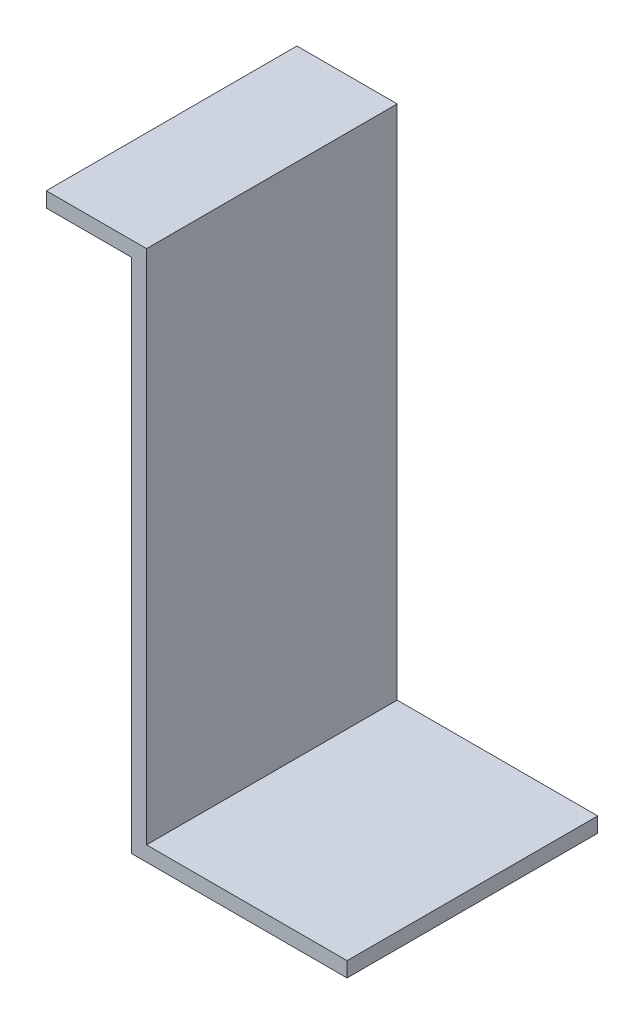
ISO-10303-21;
HEADER;
FILE_DESCRIPTION(('STEP AP214'),'2;1');
FILE_NAME('part.step','',(''),(''),'','','');
FILE_SCHEMA(('AUTOMOTIVE_DESIGN { 1 0 10303 214 1 1 1 1 }'));
ENDSEC;
DATA;
#1=APPLICATION_CONTEXT('core data for automotive mechanical design processes');
#2=APPLICATION_PROTOCOL_DEFINITION('international standard','automotive_design',2000,#1);
#3=PRODUCT_CONTEXT('',#1,'mechanical');
#4=PRODUCT('Part','Part','',(#3));
#5=PRODUCT_RELATED_PRODUCT_CATEGORY('part','',(#4));
#6=PRODUCT_DEFINITION_FORMATION('','',#4);
#7=PRODUCT_DEFINITION_CONTEXT('part definition',#1,'design');
#8=PRODUCT_DEFINITION('design','',#6,#7);
#9=PRODUCT_DEFINITION_SHAPE('','',#8);
#10=(LENGTH_UNIT() NAMED_UNIT(*) SI_UNIT(.MILLI.,.METRE.));
#11=(NAMED_UNIT(*) PLANE_ANGLE_UNIT() SI_UNIT($,.RADIAN.));
#12=(NAMED_UNIT(*) SI_UNIT($,.STERADIAN.) SOLID_ANGLE_UNIT());
#13=UNCERTAINTY_MEASURE_WITH_UNIT(LENGTH_MEASURE(1.E-05),#10,'distance_accuracy_value','');
#14=(GEOMETRIC_REPRESENTATION_CONTEXT(3) GLOBAL_UNCERTAINTY_ASSIGNED_CONTEXT((#13)) GLOBAL_UNIT_ASSIGNED_CONTEXT((#10,
#11,#12)) REPRESENTATION_CONTEXT('',''));
#15=CARTESIAN_POINT('',(0.,0.,0.));
#16=DIRECTION('',(0.,0.,1.));
#17=DIRECTION('',(1.,0.,0.));
#18=AXIS2_PLACEMENT_3D('',#15,#16,#17);
#19=CARTESIAN_POINT('',(0.,3.,0.));
#20=DIRECTION('',(0.,-1.,0.));
#21=DIRECTION('',(0.,0.,-1.));
#22=AXIS2_PLACEMENT_3D('',#19,#20,#21);
#23=PLANE('',#22);
#24=DIRECTION('',(0.,0.,-1.));
#25=VECTOR('',#24,1.);
#26=CARTESIAN_POINT('',(3.,3.,0.));
#27=LINE('',#26,#25);
#28=CARTESIAN_POINT('',(3.,3.,0.));
#29=VERTEX_POINT('',#28);
#30=CARTESIAN_POINT('',(3.,3.,-50.));
#31=VERTEX_POINT('',#30);
#32=EDGE_CURVE('E50',#29,#31,#27,.T.);
#33=ORIENTED_EDGE('',*,*,#32,.F.);
#34=DIRECTION('',(1.,0.,0.));
#35=VECTOR('',#34,1.);
#36=CARTESIAN_POINT('',(0.,3.,0.));
#37=LINE('',#36,#35);
#38=CARTESIAN_POINT('',(43.,3.,0.));
#39=VERTEX_POINT('',#38);
#40=EDGE_CURVE('E87',#29,#39,#37,.T.);
#41=ORIENTED_EDGE('',*,*,#40,.T.);
#42=DIRECTION('',(0.,0.,-1.));
#43=VECTOR('',#42,1.);
#44=CARTESIAN_POINT('',(43.,3.,0.));
#45=LINE('',#44,#43);
#46=CARTESIAN_POINT('',(43.,3.,-50.));
#47=VERTEX_POINT('',#46);
#48=EDGE_CURVE('E56',#39,#47,#45,.T.);
#49=ORIENTED_EDGE('',*,*,#48,.T.);
#50=DIRECTION('',(-1.,0.,0.));
#51=VECTOR('',#50,1.);
#52=CARTESIAN_POINT('',(0.,3.,-50.));
#53=LINE('',#52,#51);
#54=EDGE_CURVE('E97',#47,#31,#53,.T.);
#55=ORIENTED_EDGE('',*,*,#54,.T.);
#56=EDGE_LOOP('',(#33,#41,#49,#55));
#57=FACE_BOUND('',#56,.T.);
#58=ADVANCED_FACE('F33',(#57),#23,.F.);
#59=CARTESIAN_POINT('',(0.,3.,0.));
#60=DIRECTION('',(1.,0.,0.));
#61=DIRECTION('',(0.,0.,-1.));
#62=AXIS2_PLACEMENT_3D('',#59,#60,#61);
#63=PLANE('',#62);
#64=DIRECTION('',(0.,0.,1.));
#65=VECTOR('',#64,1.);
#66=CARTESIAN_POINT('',(0.,0.,0.));
#67=LINE('',#66,#65);
#68=CARTESIAN_POINT('',(0.,0.,-50.));
#69=VERTEX_POINT('',#68);
#70=CARTESIAN_POINT('',(0.,0.,0.));
#71=VERTEX_POINT('',#70);
#72=EDGE_CURVE('E93',#69,#71,#67,.T.);
#73=ORIENTED_EDGE('',*,*,#72,.T.);
#74=DIRECTION('',(0.,-1.,0.));
#75=VECTOR('',#74,1.);
#76=CARTESIAN_POINT('',(0.,3.,0.));
#77=LINE('',#76,#75);
#78=CARTESIAN_POINT('',(0.,103.,0.));
#79=VERTEX_POINT('',#78);
#80=EDGE_CURVE('E11',#79,#71,#77,.T.);
#81=ORIENTED_EDGE('',*,*,#80,.F.);
#82=DIRECTION('',(0.,0.,1.));
#83=VECTOR('',#82,1.);
#84=CARTESIAN_POINT('',(0.,103.,0.));
#85=LINE('',#84,#83);
#86=CARTESIAN_POINT('',(0.,103.,-50.));
#87=VERTEX_POINT('',#86);
#88=EDGE_CURVE('E95',#87,#79,#85,.T.);
#89=ORIENTED_EDGE('',*,*,#88,.F.);
#90=DIRECTION('',(0.,-1.,0.));
#91=VECTOR('',#90,1.);
#92=CARTESIAN_POINT('',(0.,3.,-50.));
#93=LINE('',#92,#91);
#94=EDGE_CURVE('E80',#87,#69,#93,.T.);
#95=ORIENTED_EDGE('',*,*,#94,.T.);
#96=EDGE_LOOP('',(#73,#81,#89,#95));
#97=FACE_BOUND('',#96,.T.);
#98=ADVANCED_FACE('F35',(#97),#63,.F.);
#99=CARTESIAN_POINT('',(0.,3.,0.));
#100=DIRECTION('',(0.,0.,-1.));
#101=DIRECTION('',(-1.,0.,0.));
#102=AXIS2_PLACEMENT_3D('',#99,#100,#101);
#103=PLANE('',#102);
#104=DIRECTION('',(1.,0.,0.));
#105=VECTOR('',#104,1.);
#106=CARTESIAN_POINT('',(0.,0.,0.));
#107=LINE('',#106,#105);
#108=CARTESIAN_POINT('',(43.,0.,0.));
#109=VERTEX_POINT('',#108);
#110=EDGE_CURVE('E99',#71,#109,#107,.T.);
#111=ORIENTED_EDGE('',*,*,#110,.T.);
#112=DIRECTION('',(0.,-1.,0.));
#113=VECTOR('',#112,1.);
#114=CARTESIAN_POINT('',(43.,3.,0.));
#115=LINE('',#114,#113);
#116=EDGE_CURVE('E42',#39,#109,#115,.T.);
#117=ORIENTED_EDGE('',*,*,#116,.F.);
#118=ORIENTED_EDGE('',*,*,#40,.F.);
#119=DIRECTION('',(0.,-1.,0.));
#120=VECTOR('',#119,1.);
#121=CARTESIAN_POINT('',(3.,103.,0.));
#122=LINE('',#121,#120);
#123=CARTESIAN_POINT('',(3.,106.,0.));
#124=VERTEX_POINT('',#123);
#125=EDGE_CURVE('E100',#124,#29,#122,.T.);
#126=ORIENTED_EDGE('',*,*,#125,.F.);
#127=DIRECTION('',(1.,0.,0.));
#128=VECTOR('',#127,1.);
#129=CARTESIAN_POINT('',(3.,106.,0.));
#130=LINE('',#129,#128);
#131=CARTESIAN_POINT('',(-17.,106.,0.));
#132=VERTEX_POINT('',#131);
#133=EDGE_CURVE('E155',#132,#124,#130,.T.);
#134=ORIENTED_EDGE('',*,*,#133,.F.);
#135=DIRECTION('',(0.,-1.,0.));
#136=VECTOR('',#135,1.);
#137=CARTESIAN_POINT('',(-17.,106.,0.));
#138=LINE('',#137,#136);
#139=CARTESIAN_POINT('',(-17.,103.,0.));
#140=VERTEX_POINT('',#139);
#141=EDGE_CURVE('E160',#132,#140,#138,.T.);
#142=ORIENTED_EDGE('',*,*,#141,.T.);
#143=DIRECTION('',(1.,0.,0.));
#144=VECTOR('',#143,1.);
#145=CARTESIAN_POINT('',(3.,103.,0.));
#146=LINE('',#145,#144);
#147=EDGE_CURVE('E149',#140,#79,#146,.T.);
#148=ORIENTED_EDGE('',*,*,#147,.T.);
#149=ORIENTED_EDGE('',*,*,#80,.T.);
#150=EDGE_LOOP('',(#111,#117,#118,#126,#134,#142,#148,#149));
#151=FACE_BOUND('',#150,.T.);
#152=ADVANCED_FACE('F190',(#151),#103,.F.);
#153=CARTESIAN_POINT('',(43.,3.,0.));
#154=DIRECTION('',(-1.,0.,0.));
#155=DIRECTION('',(0.,0.,1.));
#156=AXIS2_PLACEMENT_3D('',#153,#154,#155);
#157=PLANE('',#156);
#158=DIRECTION('',(0.,0.,-1.));
#159=VECTOR('',#158,1.);
#160=CARTESIAN_POINT('',(43.,0.,0.));
#161=LINE('',#160,#159);
#162=CARTESIAN_POINT('',(43.,0.,-50.));
#163=VERTEX_POINT('',#162);
#164=EDGE_CURVE('E88',#109,#163,#161,.T.);
#165=ORIENTED_EDGE('',*,*,#164,.T.);
#166=DIRECTION('',(0.,-1.,0.));
#167=VECTOR('',#166,1.);
#168=CARTESIAN_POINT('',(43.,3.,-50.));
#169=LINE('',#168,#167);
#170=EDGE_CURVE('E83',#47,#163,#169,.T.);
#171=ORIENTED_EDGE('',*,*,#170,.F.);
#172=ORIENTED_EDGE('',*,*,#48,.F.);
#173=ORIENTED_EDGE('',*,*,#116,.T.);
#174=EDGE_LOOP('',(#165,#171,#172,#173));
#175=FACE_BOUND('',#174,.T.);
#176=ADVANCED_FACE('F198',(#175),#157,.F.);
#177=CARTESIAN_POINT('',(0.,3.,-50.));
#178=DIRECTION('',(0.,0.,1.));
#179=DIRECTION('',(1.,0.,0.));
#180=AXIS2_PLACEMENT_3D('',#177,#178,#179);
#181=PLANE('',#180);
#182=DIRECTION('',(-1.,0.,0.));
#183=VECTOR('',#182,1.);
#184=CARTESIAN_POINT('',(0.,0.,-50.));
#185=LINE('',#184,#183);
#186=EDGE_CURVE('E76',#163,#69,#185,.T.);
#187=ORIENTED_EDGE('',*,*,#186,.T.);
#188=ORIENTED_EDGE('',*,*,#94,.F.);
#189=DIRECTION('',(-1.,0.,0.));
#190=VECTOR('',#189,1.);
#191=CARTESIAN_POINT('',(3.,103.,-50.));
#192=LINE('',#191,#190);
#193=CARTESIAN_POINT('',(-17.,103.,-50.));
#194=VERTEX_POINT('',#193);
#195=EDGE_CURVE('E145',#87,#194,#192,.T.);
#196=ORIENTED_EDGE('',*,*,#195,.T.);
#197=DIRECTION('',(0.,-1.,0.));
#198=VECTOR('',#197,1.);
#199=CARTESIAN_POINT('',(-17.,106.,-50.));
#200=LINE('',#199,#198);
#201=CARTESIAN_POINT('',(-17.,106.,-50.));
#202=VERTEX_POINT('',#201);
#203=EDGE_CURVE('E131',#202,#194,#200,.T.);
#204=ORIENTED_EDGE('',*,*,#203,.F.);
#205=DIRECTION('',(-1.,0.,0.));
#206=VECTOR('',#205,1.);
#207=CARTESIAN_POINT('',(3.,106.,-50.));
#208=LINE('',#207,#206);
#209=CARTESIAN_POINT('',(3.,106.,-50.));
#210=VERTEX_POINT('',#209);
#211=EDGE_CURVE('E134',#210,#202,#208,.T.);
#212=ORIENTED_EDGE('',*,*,#211,.F.);
#213=DIRECTION('',(0.,-1.,0.));
#214=VECTOR('',#213,1.);
#215=CARTESIAN_POINT('',(3.,103.,-50.));
#216=LINE('',#215,#214);
#217=EDGE_CURVE('E104',#210,#31,#216,.T.);
#218=ORIENTED_EDGE('',*,*,#217,.T.);
#219=ORIENTED_EDGE('',*,*,#54,.F.);
#220=ORIENTED_EDGE('',*,*,#170,.T.);
#221=EDGE_LOOP('',(#187,#188,#196,#204,#212,#218,#219,#220));
#222=FACE_BOUND('',#221,.T.);
#223=ADVANCED_FACE('F78',(#222),#181,.F.);
#224=CARTESIAN_POINT('',(0.,0.,0.));
#225=DIRECTION('',(0.,-1.,0.));
#226=DIRECTION('',(0.,0.,-1.));
#227=AXIS2_PLACEMENT_3D('',#224,#225,#226);
#228=PLANE('',#227);
#229=ORIENTED_EDGE('',*,*,#72,.F.);
#230=ORIENTED_EDGE('',*,*,#186,.F.);
#231=ORIENTED_EDGE('',*,*,#164,.F.);
#232=ORIENTED_EDGE('',*,*,#110,.F.);
#233=EDGE_LOOP('',(#229,#230,#231,#232));
#234=FACE_BOUND('',#233,.T.);
#235=ADVANCED_FACE('F98',(#234),#228,.T.);
#236=CARTESIAN_POINT('',(3.,103.,0.));
#237=DIRECTION('',(-1.,0.,0.));
#238=DIRECTION('',(0.,0.,1.));
#239=AXIS2_PLACEMENT_3D('',#236,#237,#238);
#240=PLANE('',#239);
#241=ORIENTED_EDGE('',*,*,#32,.T.);
#242=ORIENTED_EDGE('',*,*,#217,.F.);
#243=DIRECTION('',(0.,0.,-1.));
#244=VECTOR('',#243,1.);
#245=CARTESIAN_POINT('',(3.,106.,-50.));
#246=LINE('',#245,#244);
#247=EDGE_CURVE('E180',#124,#210,#246,.T.);
#248=ORIENTED_EDGE('',*,*,#247,.F.);
#249=ORIENTED_EDGE('',*,*,#125,.T.);
#250=EDGE_LOOP('',(#241,#242,#248,#249));
#251=FACE_BOUND('',#250,.T.);
#252=ADVANCED_FACE('F126',(#251),#240,.F.);
#253=CARTESIAN_POINT('',(-17.,106.,-50.));
#254=DIRECTION('',(1.,0.,0.));
#255=DIRECTION('',(0.,0.,-1.));
#256=AXIS2_PLACEMENT_3D('',#253,#254,#255);
#257=PLANE('',#256);
#258=DIRECTION('',(0.,0.,1.));
#259=VECTOR('',#258,1.);
#260=CARTESIAN_POINT('',(-17.,103.,-50.));
#261=LINE('',#260,#259);
#262=EDGE_CURVE('E148',#194,#140,#261,.T.);
#263=ORIENTED_EDGE('',*,*,#262,.T.);
#264=ORIENTED_EDGE('',*,*,#141,.F.);
#265=DIRECTION('',(0.,0.,1.));
#266=VECTOR('',#265,1.);
#267=CARTESIAN_POINT('',(-17.,106.,-50.));
#268=LINE('',#267,#266);
#269=EDGE_CURVE('E172',#202,#132,#268,.T.);
#270=ORIENTED_EDGE('',*,*,#269,.F.);
#271=ORIENTED_EDGE('',*,*,#203,.T.);
#272=EDGE_LOOP('',(#263,#264,#270,#271));
#273=FACE_BOUND('',#272,.T.);
#274=ADVANCED_FACE('F167',(#273),#257,.F.);
#275=CARTESIAN_POINT('',(0.,106.,0.));
#276=DIRECTION('',(0.,-1.,0.));
#277=DIRECTION('',(0.,0.,-1.));
#278=AXIS2_PLACEMENT_3D('',#275,#276,#277);
#279=PLANE('',#278);
#280=ORIENTED_EDGE('',*,*,#247,.T.);
#281=ORIENTED_EDGE('',*,*,#211,.T.);
#282=ORIENTED_EDGE('',*,*,#269,.T.);
#283=ORIENTED_EDGE('',*,*,#133,.T.);
#284=EDGE_LOOP('',(#280,#281,#282,#283));
#285=FACE_BOUND('',#284,.T.);
#286=ADVANCED_FACE('F188',(#285),#279,.F.);
#287=CARTESIAN_POINT('',(0.,103.,0.));
#288=DIRECTION('',(0.,-1.,0.));
#289=DIRECTION('',(0.,0.,-1.));
#290=AXIS2_PLACEMENT_3D('',#287,#288,#289);
#291=PLANE('',#290);
#292=ORIENTED_EDGE('',*,*,#195,.F.);
#293=ORIENTED_EDGE('',*,*,#88,.T.);
#294=ORIENTED_EDGE('',*,*,#147,.F.);
#295=ORIENTED_EDGE('',*,*,#262,.F.);
#296=EDGE_LOOP('',(#292,#293,#294,#295));
#297=FACE_BOUND('',#296,.T.);
#298=ADVANCED_FACE('F176',(#297),#291,.T.);
#299=CLOSED_SHELL('',(#58,#98,#152,#176,#223,#235,#252,#274,#286,#298));
#300=MANIFOLD_SOLID_BREP('B2',#299);
#301=ADVANCED_BREP_SHAPE_REPRESENTATION('',(#18,#300),#14);
#302=SHAPE_DEFINITION_REPRESENTATION(#9,#301);
ENDSEC;
END-ISO-10303-21;
